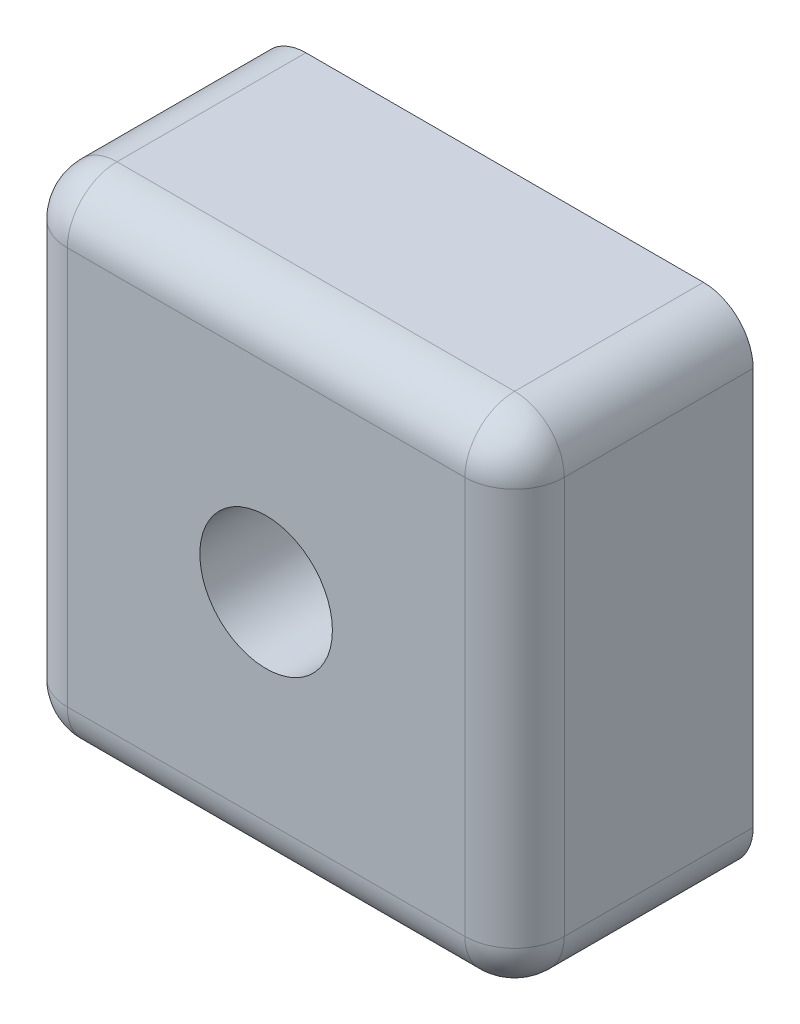
ISO-10303-21;
HEADER;
FILE_DESCRIPTION(('STEP AP214'),'2;1');
FILE_NAME('part.step','',(''),(''),'','','');
FILE_SCHEMA(('AUTOMOTIVE_DESIGN { 1 0 10303 214 1 1 1 1 }'));
ENDSEC;
DATA;
#1=APPLICATION_CONTEXT('core data for automotive mechanical design processes');
#2=APPLICATION_PROTOCOL_DEFINITION('international standard','automotive_design',2000,#1);
#3=PRODUCT_CONTEXT('',#1,'mechanical');
#4=PRODUCT('Part','Part','',(#3));
#5=PRODUCT_RELATED_PRODUCT_CATEGORY('part','',(#4));
#6=PRODUCT_DEFINITION_FORMATION('','',#4);
#7=PRODUCT_DEFINITION_CONTEXT('part definition',#1,'design');
#8=PRODUCT_DEFINITION('design','',#6,#7);
#9=PRODUCT_DEFINITION_SHAPE('','',#8);
#10=(LENGTH_UNIT() NAMED_UNIT(*) SI_UNIT(.MILLI.,.METRE.));
#11=(NAMED_UNIT(*) PLANE_ANGLE_UNIT() SI_UNIT($,.RADIAN.));
#12=(NAMED_UNIT(*) SI_UNIT($,.STERADIAN.) SOLID_ANGLE_UNIT());
#13=UNCERTAINTY_MEASURE_WITH_UNIT(LENGTH_MEASURE(1.E-05),#10,'distance_accuracy_value','');
#14=(GEOMETRIC_REPRESENTATION_CONTEXT(3) GLOBAL_UNCERTAINTY_ASSIGNED_CONTEXT((#13)) GLOBAL_UNIT_ASSIGNED_CONTEXT((#10,
#11,#12)) REPRESENTATION_CONTEXT('',''));
#15=CARTESIAN_POINT('',(0.,0.,0.));
#16=DIRECTION('',(0.,0.,1.));
#17=DIRECTION('',(1.,0.,0.));
#18=AXIS2_PLACEMENT_3D('',#15,#16,#17);
#19=CARTESIAN_POINT('',(50.,0.,48.));
#20=DIRECTION('',(-1.,0.,0.));
#21=DIRECTION('',(0.,0.,1.));
#22=AXIS2_PLACEMENT_3D('',#19,#20,#21);
#23=PLANE('',#22);
#24=DIRECTION('',(0.,0.,-1.));
#25=VECTOR('',#24,1.);
#26=CARTESIAN_POINT('',(50.,40.,48.));
#27=LINE('',#26,#25);
#28=CARTESIAN_POINT('',(50.,40.,0.));
#29=VERTEX_POINT('',#28);
#30=CARTESIAN_POINT('',(50.,40.,38.));
#31=VERTEX_POINT('',#30);
#32=EDGE_CURVE('E160',#29,#31,#27,.F.);
#33=ORIENTED_EDGE('',*,*,#32,.T.);
#34=DIRECTION('',(0.,1.,0.));
#35=VECTOR('',#34,1.);
#36=CARTESIAN_POINT('',(50.,-40.,38.));
#37=LINE('',#36,#35);
#38=CARTESIAN_POINT('',(50.,-40.,38.));
#39=VERTEX_POINT('',#38);
#40=EDGE_CURVE('E187',#31,#39,#37,.F.);
#41=ORIENTED_EDGE('',*,*,#40,.T.);
#42=DIRECTION('',(0.,0.,-1.));
#43=VECTOR('',#42,1.);
#44=CARTESIAN_POINT('',(50.,-40.,48.));
#45=LINE('',#44,#43);
#46=CARTESIAN_POINT('',(50.,-40.,0.));
#47=VERTEX_POINT('',#46);
#48=EDGE_CURVE('E162',#39,#47,#45,.T.);
#49=ORIENTED_EDGE('',*,*,#48,.T.);
#50=DIRECTION('',(0.,1.,0.));
#51=VECTOR('',#50,1.);
#52=CARTESIAN_POINT('',(50.,0.,0.));
#53=LINE('',#52,#51);
#54=EDGE_CURVE('E217',#47,#29,#53,.T.);
#55=ORIENTED_EDGE('',*,*,#54,.T.);
#56=EDGE_LOOP('',(#33,#41,#49,#55));
#57=FACE_BOUND('',#56,.T.);
#58=ADVANCED_FACE('F38',(#57),#23,.F.);
#59=CARTESIAN_POINT('',(0.,50.,48.));
#60=DIRECTION('',(0.,1.,0.));
#61=DIRECTION('',(0.,0.,1.));
#62=AXIS2_PLACEMENT_3D('',#59,#60,#61);
#63=PLANE('',#62);
#64=DIRECTION('',(0.,0.,-1.));
#65=VECTOR('',#64,1.);
#66=CARTESIAN_POINT('',(-40.,50.,48.));
#67=LINE('',#66,#65);
#68=CARTESIAN_POINT('',(-40.,50.,0.));
#69=VERTEX_POINT('',#68);
#70=CARTESIAN_POINT('',(-40.,50.,38.));
#71=VERTEX_POINT('',#70);
#72=EDGE_CURVE('E164',#69,#71,#67,.F.);
#73=ORIENTED_EDGE('',*,*,#72,.T.);
#74=DIRECTION('',(1.,0.,0.));
#75=VECTOR('',#74,1.);
#76=CARTESIAN_POINT('',(0.,50.,38.));
#77=LINE('',#76,#75);
#78=CARTESIAN_POINT('',(40.,50.,38.));
#79=VERTEX_POINT('',#78);
#80=EDGE_CURVE('E11',#71,#79,#77,.T.);
#81=ORIENTED_EDGE('',*,*,#80,.T.);
#82=DIRECTION('',(0.,0.,-1.));
#83=VECTOR('',#82,1.);
#84=CARTESIAN_POINT('',(40.,50.,0.));
#85=LINE('',#84,#83);
#86=CARTESIAN_POINT('',(40.,50.,0.));
#87=VERTEX_POINT('',#86);
#88=EDGE_CURVE('E166',#79,#87,#85,.T.);
#89=ORIENTED_EDGE('',*,*,#88,.T.);
#90=DIRECTION('',(1.,0.,0.));
#91=VECTOR('',#90,1.);
#92=CARTESIAN_POINT('',(0.,50.,0.));
#93=LINE('',#92,#91);
#94=EDGE_CURVE('E149',#69,#87,#93,.T.);
#95=ORIENTED_EDGE('',*,*,#94,.F.);
#96=EDGE_LOOP('',(#73,#81,#89,#95));
#97=FACE_BOUND('',#96,.T.);
#98=ADVANCED_FACE('F228',(#97),#63,.T.);
#99=CARTESIAN_POINT('',(-50.,0.,48.));
#100=DIRECTION('',(-1.,0.,0.));
#101=DIRECTION('',(0.,0.,1.));
#102=AXIS2_PLACEMENT_3D('',#99,#100,#101);
#103=PLANE('',#102);
#104=DIRECTION('',(0.,0.,-1.));
#105=VECTOR('',#104,1.);
#106=CARTESIAN_POINT('',(-50.,-40.,48.));
#107=LINE('',#106,#105);
#108=CARTESIAN_POINT('',(-50.,-40.,0.));
#109=VERTEX_POINT('',#108);
#110=CARTESIAN_POINT('',(-50.,-40.,38.));
#111=VERTEX_POINT('',#110);
#112=EDGE_CURVE('E134',#109,#111,#107,.F.);
#113=ORIENTED_EDGE('',*,*,#112,.T.);
#114=DIRECTION('',(0.,1.,0.));
#115=VECTOR('',#114,1.);
#116=CARTESIAN_POINT('',(-50.,0.,38.));
#117=LINE('',#116,#115);
#118=CARTESIAN_POINT('',(-50.,40.,38.));
#119=VERTEX_POINT('',#118);
#120=EDGE_CURVE('E171',#111,#119,#117,.T.);
#121=ORIENTED_EDGE('',*,*,#120,.T.);
#122=DIRECTION('',(0.,0.,-1.));
#123=VECTOR('',#122,1.);
#124=CARTESIAN_POINT('',(-50.,40.,48.));
#125=LINE('',#124,#123);
#126=CARTESIAN_POINT('',(-50.,40.,0.));
#127=VERTEX_POINT('',#126);
#128=EDGE_CURVE('E138',#119,#127,#125,.T.);
#129=ORIENTED_EDGE('',*,*,#128,.T.);
#130=DIRECTION('',(0.,1.,0.));
#131=VECTOR('',#130,1.);
#132=CARTESIAN_POINT('',(-50.,0.,0.));
#133=LINE('',#132,#131);
#134=EDGE_CURVE('E145',#109,#127,#133,.T.);
#135=ORIENTED_EDGE('',*,*,#134,.F.);
#136=EDGE_LOOP('',(#113,#121,#129,#135));
#137=FACE_BOUND('',#136,.T.);
#138=ADVANCED_FACE('F262',(#137),#103,.T.);
#139=CARTESIAN_POINT('',(0.,0.,48.));
#140=DIRECTION('',(0.,0.,-1.));
#141=DIRECTION('',(-1.,0.,0.));
#142=AXIS2_PLACEMENT_3D('',#139,#140,#141);
#143=CYLINDRICAL_SURFACE('',#142,13.33983914613);
#144=CARTESIAN_POINT('',(0.,0.,48.));
#145=DIRECTION('',(0.,0.,1.));
#146=DIRECTION('',(1.,0.,0.));
#147=AXIS2_PLACEMENT_3D('',#144,#145,#146);
#148=CIRCLE('',#147,13.33983914613);
#149=CARTESIAN_POINT('',(13.33983914613,0.,48.));
#150=VERTEX_POINT('',#149);
#151=EDGE_CURVE('E144',#150,#150,#148,.T.);
#152=ORIENTED_EDGE('',*,*,#151,.T.);
#153=EDGE_LOOP('',(#152));
#154=FACE_BOUND('',#153,.T.);
#155=CARTESIAN_POINT('',(0.,0.,0.));
#156=DIRECTION('',(0.,0.,1.));
#157=DIRECTION('',(1.,0.,0.));
#158=AXIS2_PLACEMENT_3D('',#155,#156,#157);
#159=CIRCLE('',#158,13.33983914613);
#160=CARTESIAN_POINT('',(13.33983914613,0.,0.));
#161=VERTEX_POINT('',#160);
#162=EDGE_CURVE('E212',#161,#161,#159,.T.);
#163=ORIENTED_EDGE('',*,*,#162,.F.);
#164=EDGE_LOOP('',(#163));
#165=FACE_BOUND('',#164,.T.);
#166=ADVANCED_FACE('F264',(#154,#165),#143,.F.);
#167=CARTESIAN_POINT('',(0.,-50.,48.));
#168=DIRECTION('',(0.,1.,0.));
#169=DIRECTION('',(0.,0.,1.));
#170=AXIS2_PLACEMENT_3D('',#167,#168,#169);
#171=PLANE('',#170);
#172=DIRECTION('',(0.,0.,-1.));
#173=VECTOR('',#172,1.);
#174=CARTESIAN_POINT('',(40.,-50.,48.));
#175=LINE('',#174,#173);
#176=CARTESIAN_POINT('',(40.,-50.,0.));
#177=VERTEX_POINT('',#176);
#178=CARTESIAN_POINT('',(40.,-50.,38.));
#179=VERTEX_POINT('',#178);
#180=EDGE_CURVE('E128',#177,#179,#175,.F.);
#181=ORIENTED_EDGE('',*,*,#180,.T.);
#182=DIRECTION('',(1.,0.,0.));
#183=VECTOR('',#182,1.);
#184=CARTESIAN_POINT('',(-40.,-50.,38.));
#185=LINE('',#184,#183);
#186=CARTESIAN_POINT('',(-40.,-50.,38.));
#187=VERTEX_POINT('',#186);
#188=EDGE_CURVE('E124',#179,#187,#185,.F.);
#189=ORIENTED_EDGE('',*,*,#188,.T.);
#190=DIRECTION('',(0.,0.,-1.));
#191=VECTOR('',#190,1.);
#192=CARTESIAN_POINT('',(-40.,-50.,0.));
#193=LINE('',#192,#191);
#194=CARTESIAN_POINT('',(-40.,-50.,0.));
#195=VERTEX_POINT('',#194);
#196=EDGE_CURVE('E116',#187,#195,#193,.T.);
#197=ORIENTED_EDGE('',*,*,#196,.T.);
#198=DIRECTION('',(1.,0.,0.));
#199=VECTOR('',#198,1.);
#200=CARTESIAN_POINT('',(0.,-50.,0.));
#201=LINE('',#200,#199);
#202=EDGE_CURVE('E121',#195,#177,#201,.T.);
#203=ORIENTED_EDGE('',*,*,#202,.T.);
#204=EDGE_LOOP('',(#181,#189,#197,#203));
#205=FACE_BOUND('',#204,.T.);
#206=ADVANCED_FACE('F119',(#205),#171,.F.);
#207=CARTESIAN_POINT('',(0.,0.,48.));
#208=DIRECTION('',(0.,0.,1.));
#209=DIRECTION('',(1.,0.,0.));
#210=AXIS2_PLACEMENT_3D('',#207,#208,#209);
#211=PLANE('',#210);
#212=DIRECTION('',(1.,0.,0.));
#213=VECTOR('',#212,1.);
#214=CARTESIAN_POINT('',(0.,40.,48.));
#215=LINE('',#214,#213);
#216=CARTESIAN_POINT('',(40.,40.,48.));
#217=VERTEX_POINT('',#216);
#218=CARTESIAN_POINT('',(-40.,40.,48.));
#219=VERTEX_POINT('',#218);
#220=EDGE_CURVE('E173',#217,#219,#215,.F.);
#221=ORIENTED_EDGE('',*,*,#220,.T.);
#222=DIRECTION('',(0.,1.,0.));
#223=VECTOR('',#222,1.);
#224=CARTESIAN_POINT('',(-40.,0.,48.));
#225=LINE('',#224,#223);
#226=CARTESIAN_POINT('',(-40.,-40.,48.));
#227=VERTEX_POINT('',#226);
#228=EDGE_CURVE('E179',#219,#227,#225,.F.);
#229=ORIENTED_EDGE('',*,*,#228,.T.);
#230=DIRECTION('',(1.,0.,0.));
#231=VECTOR('',#230,1.);
#232=CARTESIAN_POINT('',(40.,-40.,48.));
#233=LINE('',#232,#231);
#234=CARTESIAN_POINT('',(40.,-40.,48.));
#235=VERTEX_POINT('',#234);
#236=EDGE_CURVE('E177',#227,#235,#233,.T.);
#237=ORIENTED_EDGE('',*,*,#236,.T.);
#238=DIRECTION('',(0.,1.,0.));
#239=VECTOR('',#238,1.);
#240=CARTESIAN_POINT('',(40.,40.,48.));
#241=LINE('',#240,#239);
#242=EDGE_CURVE('E175',#235,#217,#241,.T.);
#243=ORIENTED_EDGE('',*,*,#242,.T.);
#244=EDGE_LOOP('',(#221,#229,#237,#243));
#245=FACE_BOUND('',#244,.T.);
#246=ORIENTED_EDGE('',*,*,#151,.F.);
#247=EDGE_LOOP('',(#246));
#248=FACE_BOUND('',#247,.T.);
#249=ADVANCED_FACE('F328',(#245,#248),#211,.T.);
#250=CARTESIAN_POINT('',(0.,0.,0.));
#251=DIRECTION('',(0.,0.,1.));
#252=DIRECTION('',(1.,0.,0.));
#253=AXIS2_PLACEMENT_3D('',#250,#251,#252);
#254=PLANE('',#253);
#255=ORIENTED_EDGE('',*,*,#162,.T.);
#256=EDGE_LOOP('',(#255));
#257=FACE_BOUND('',#256,.T.);
#258=ORIENTED_EDGE('',*,*,#202,.F.);
#259=CARTESIAN_POINT('',(-40.,-40.,0.));
#260=DIRECTION('',(0.,0.,1.));
#261=DIRECTION('',(1.,0.,0.));
#262=AXIS2_PLACEMENT_3D('',#259,#260,#261);
#263=CIRCLE('',#262,10.);
#264=EDGE_CURVE('E131',#195,#109,#263,.F.);
#265=ORIENTED_EDGE('',*,*,#264,.T.);
#266=ORIENTED_EDGE('',*,*,#134,.T.);
#267=CARTESIAN_POINT('',(-40.,40.,0.));
#268=DIRECTION('',(0.,0.,1.));
#269=DIRECTION('',(1.,0.,0.));
#270=AXIS2_PLACEMENT_3D('',#267,#268,#269);
#271=CIRCLE('',#270,10.);
#272=EDGE_CURVE('E127',#127,#69,#271,.F.);
#273=ORIENTED_EDGE('',*,*,#272,.T.);
#274=ORIENTED_EDGE('',*,*,#94,.T.);
#275=CARTESIAN_POINT('',(40.,40.,0.));
#276=DIRECTION('',(0.,0.,1.));
#277=DIRECTION('',(1.,0.,0.));
#278=AXIS2_PLACEMENT_3D('',#275,#276,#277);
#279=CIRCLE('',#278,10.);
#280=EDGE_CURVE('E155',#87,#29,#279,.F.);
#281=ORIENTED_EDGE('',*,*,#280,.T.);
#282=ORIENTED_EDGE('',*,*,#54,.F.);
#283=CARTESIAN_POINT('',(40.,-40.,0.));
#284=DIRECTION('',(0.,0.,1.));
#285=DIRECTION('',(1.,0.,0.));
#286=AXIS2_PLACEMENT_3D('',#283,#284,#285);
#287=CIRCLE('',#286,10.);
#288=EDGE_CURVE('E139',#47,#177,#287,.F.);
#289=ORIENTED_EDGE('',*,*,#288,.T.);
#290=EDGE_LOOP('',(#258,#265,#266,#273,#274,#281,#282,#289));
#291=FACE_BOUND('',#290,.T.);
#292=ADVANCED_FACE('F141',(#257,#291),#254,.F.);
#293=CARTESIAN_POINT('',(-40.,-40.,48.));
#294=DIRECTION('',(0.,0.,1.));
#295=DIRECTION('',(1.,0.,0.));
#296=AXIS2_PLACEMENT_3D('',#293,#294,#295);
#297=CYLINDRICAL_SURFACE('',#296,10.);
#298=ORIENTED_EDGE('',*,*,#196,.F.);
#299=CARTESIAN_POINT('',(-40.,-40.,38.));
#300=DIRECTION('',(0.,0.,1.));
#301=DIRECTION('',(1.,0.,0.));
#302=AXIS2_PLACEMENT_3D('',#299,#300,#301);
#303=CIRCLE('',#302,10.);
#304=EDGE_CURVE('E182',#187,#111,#303,.F.);
#305=ORIENTED_EDGE('',*,*,#304,.T.);
#306=ORIENTED_EDGE('',*,*,#112,.F.);
#307=ORIENTED_EDGE('',*,*,#264,.F.);
#308=EDGE_LOOP('',(#298,#305,#306,#307));
#309=FACE_BOUND('',#308,.T.);
#310=ADVANCED_FACE('F132',(#309),#297,.T.);
#311=CARTESIAN_POINT('',(40.,-40.,48.));
#312=DIRECTION('',(0.,0.,-1.));
#313=DIRECTION('',(-1.,0.,0.));
#314=AXIS2_PLACEMENT_3D('',#311,#312,#313);
#315=CYLINDRICAL_SURFACE('',#314,10.);
#316=ORIENTED_EDGE('',*,*,#48,.F.);
#317=CARTESIAN_POINT('',(40.,-40.,38.));
#318=DIRECTION('',(0.,0.,-1.));
#319=DIRECTION('',(-1.,0.,0.));
#320=AXIS2_PLACEMENT_3D('',#317,#318,#319);
#321=CIRCLE('',#320,10.);
#322=EDGE_CURVE('E185',#39,#179,#321,.T.);
#323=ORIENTED_EDGE('',*,*,#322,.T.);
#324=ORIENTED_EDGE('',*,*,#180,.F.);
#325=ORIENTED_EDGE('',*,*,#288,.F.);
#326=EDGE_LOOP('',(#316,#323,#324,#325));
#327=FACE_BOUND('',#326,.T.);
#328=ADVANCED_FACE('F255',(#327),#315,.T.);
#329=CARTESIAN_POINT('',(40.,40.,48.));
#330=DIRECTION('',(0.,0.,1.));
#331=DIRECTION('',(1.,0.,0.));
#332=AXIS2_PLACEMENT_3D('',#329,#330,#331);
#333=CYLINDRICAL_SURFACE('',#332,10.);
#334=ORIENTED_EDGE('',*,*,#88,.F.);
#335=CARTESIAN_POINT('',(40.,40.,38.));
#336=DIRECTION('',(0.,0.,1.));
#337=DIRECTION('',(1.,0.,0.));
#338=AXIS2_PLACEMENT_3D('',#335,#336,#337);
#339=CIRCLE('',#338,10.);
#340=EDGE_CURVE('E47',#79,#31,#339,.F.);
#341=ORIENTED_EDGE('',*,*,#340,.T.);
#342=ORIENTED_EDGE('',*,*,#32,.F.);
#343=ORIENTED_EDGE('',*,*,#280,.F.);
#344=EDGE_LOOP('',(#334,#341,#342,#343));
#345=FACE_BOUND('',#344,.T.);
#346=ADVANCED_FACE('F283',(#345),#333,.T.);
#347=CARTESIAN_POINT('',(-40.,40.,48.));
#348=DIRECTION('',(0.,0.,-1.));
#349=DIRECTION('',(-1.,0.,0.));
#350=AXIS2_PLACEMENT_3D('',#347,#348,#349);
#351=CYLINDRICAL_SURFACE('',#350,10.);
#352=ORIENTED_EDGE('',*,*,#128,.F.);
#353=CARTESIAN_POINT('',(-40.,40.,38.));
#354=DIRECTION('',(0.,0.,-1.));
#355=DIRECTION('',(-1.,0.,0.));
#356=AXIS2_PLACEMENT_3D('',#353,#354,#355);
#357=CIRCLE('',#356,10.);
#358=EDGE_CURVE('E168',#119,#71,#357,.T.);
#359=ORIENTED_EDGE('',*,*,#358,.T.);
#360=ORIENTED_EDGE('',*,*,#72,.F.);
#361=ORIENTED_EDGE('',*,*,#272,.F.);
#362=EDGE_LOOP('',(#352,#359,#360,#361));
#363=FACE_BOUND('',#362,.T.);
#364=ADVANCED_FACE('F231',(#363),#351,.T.);
#365=CARTESIAN_POINT('',(40.,-40.,38.));
#366=DIRECTION('',(0.,0.,1.));
#367=DIRECTION('',(1.,0.,0.));
#368=AXIS2_PLACEMENT_3D('',#365,#366,#367);
#369=SPHERICAL_SURFACE('',#368,10.);
#370=CARTESIAN_POINT('',(40.,-40.,38.));
#371=DIRECTION('',(-1.,0.,0.));
#372=DIRECTION('',(0.,0.,1.));
#373=AXIS2_PLACEMENT_3D('',#370,#371,#372);
#374=CIRCLE('',#373,10.);
#375=EDGE_CURVE('E205',#179,#235,#374,.T.);
#376=ORIENTED_EDGE('',*,*,#375,.F.);
#377=ORIENTED_EDGE('',*,*,#322,.F.);
#378=CARTESIAN_POINT('',(40.,-40.,38.));
#379=DIRECTION('',(0.,1.,0.));
#380=DIRECTION('',(0.,0.,1.));
#381=AXIS2_PLACEMENT_3D('',#378,#379,#380);
#382=CIRCLE('',#381,10.);
#383=EDGE_CURVE('E42',#235,#39,#382,.T.);
#384=ORIENTED_EDGE('',*,*,#383,.F.);
#385=EDGE_LOOP('',(#376,#377,#384));
#386=FACE_BOUND('',#385,.T.);
#387=ADVANCED_FACE('F40',(#386),#369,.T.);
#388=CARTESIAN_POINT('',(40.,0.,38.));
#389=DIRECTION('',(0.,-1.,0.));
#390=DIRECTION('',(0.,0.,-1.));
#391=AXIS2_PLACEMENT_3D('',#388,#389,#390);
#392=CYLINDRICAL_SURFACE('',#391,10.);
#393=ORIENTED_EDGE('',*,*,#383,.T.);
#394=ORIENTED_EDGE('',*,*,#40,.F.);
#395=CARTESIAN_POINT('',(40.,40.,38.));
#396=DIRECTION('',(0.,1.,0.));
#397=DIRECTION('',(0.,0.,1.));
#398=AXIS2_PLACEMENT_3D('',#395,#396,#397);
#399=CIRCLE('',#398,10.);
#400=EDGE_CURVE('E203',#217,#31,#399,.T.);
#401=ORIENTED_EDGE('',*,*,#400,.F.);
#402=ORIENTED_EDGE('',*,*,#242,.F.);
#403=EDGE_LOOP('',(#393,#394,#401,#402));
#404=FACE_BOUND('',#403,.T.);
#405=ADVANCED_FACE('F250',(#404),#392,.T.);
#406=CARTESIAN_POINT('',(0.,-40.,38.));
#407=DIRECTION('',(-1.,0.,0.));
#408=DIRECTION('',(0.,0.,1.));
#409=AXIS2_PLACEMENT_3D('',#406,#407,#408);
#410=CYLINDRICAL_SURFACE('',#409,10.);
#411=ORIENTED_EDGE('',*,*,#375,.T.);
#412=ORIENTED_EDGE('',*,*,#236,.F.);
#413=CARTESIAN_POINT('',(-40.,-40.,38.));
#414=DIRECTION('',(-1.,0.,0.));
#415=DIRECTION('',(0.,0.,1.));
#416=AXIS2_PLACEMENT_3D('',#413,#414,#415);
#417=CIRCLE('',#416,10.);
#418=EDGE_CURVE('E200',#187,#227,#417,.T.);
#419=ORIENTED_EDGE('',*,*,#418,.F.);
#420=ORIENTED_EDGE('',*,*,#188,.F.);
#421=EDGE_LOOP('',(#411,#412,#419,#420));
#422=FACE_BOUND('',#421,.T.);
#423=ADVANCED_FACE('F257',(#422),#410,.T.);
#424=CARTESIAN_POINT('',(40.,40.,38.));
#425=DIRECTION('',(0.,0.,1.));
#426=DIRECTION('',(1.,0.,0.));
#427=AXIS2_PLACEMENT_3D('',#424,#425,#426);
#428=SPHERICAL_SURFACE('',#427,10.);
#429=ORIENTED_EDGE('',*,*,#400,.T.);
#430=ORIENTED_EDGE('',*,*,#340,.F.);
#431=CARTESIAN_POINT('',(40.,40.,38.));
#432=DIRECTION('',(-1.,0.,0.));
#433=DIRECTION('',(0.,0.,1.));
#434=AXIS2_PLACEMENT_3D('',#431,#432,#433);
#435=CIRCLE('',#434,10.);
#436=EDGE_CURVE('E197',#217,#79,#435,.T.);
#437=ORIENTED_EDGE('',*,*,#436,.F.);
#438=EDGE_LOOP('',(#429,#430,#437));
#439=FACE_BOUND('',#438,.T.);
#440=ADVANCED_FACE('F248',(#439),#428,.T.);
#441=CARTESIAN_POINT('',(-40.,-40.,38.));
#442=DIRECTION('',(0.,0.,1.));
#443=DIRECTION('',(1.,0.,0.));
#444=AXIS2_PLACEMENT_3D('',#441,#442,#443);
#445=SPHERICAL_SURFACE('',#444,10.);
#446=ORIENTED_EDGE('',*,*,#304,.F.);
#447=ORIENTED_EDGE('',*,*,#418,.T.);
#448=CARTESIAN_POINT('',(-40.,-40.,38.));
#449=DIRECTION('',(0.,1.,0.));
#450=DIRECTION('',(0.,0.,1.));
#451=AXIS2_PLACEMENT_3D('',#448,#449,#450);
#452=CIRCLE('',#451,10.);
#453=EDGE_CURVE('E195',#111,#227,#452,.T.);
#454=ORIENTED_EDGE('',*,*,#453,.F.);
#455=EDGE_LOOP('',(#446,#447,#454));
#456=FACE_BOUND('',#455,.T.);
#457=ADVANCED_FACE('F260',(#456),#445,.T.);
#458=CARTESIAN_POINT('',(0.,40.,38.));
#459=DIRECTION('',(1.,0.,0.));
#460=DIRECTION('',(0.,0.,-1.));
#461=AXIS2_PLACEMENT_3D('',#458,#459,#460);
#462=CYLINDRICAL_SURFACE('',#461,10.);
#463=ORIENTED_EDGE('',*,*,#436,.T.);
#464=ORIENTED_EDGE('',*,*,#80,.F.);
#465=CARTESIAN_POINT('',(-40.,40.,38.));
#466=DIRECTION('',(-1.,0.,0.));
#467=DIRECTION('',(0.,0.,1.));
#468=AXIS2_PLACEMENT_3D('',#465,#466,#467);
#469=CIRCLE('',#468,10.);
#470=EDGE_CURVE('E193',#219,#71,#469,.T.);
#471=ORIENTED_EDGE('',*,*,#470,.F.);
#472=ORIENTED_EDGE('',*,*,#220,.F.);
#473=EDGE_LOOP('',(#463,#464,#471,#472));
#474=FACE_BOUND('',#473,.T.);
#475=ADVANCED_FACE('F245',(#474),#462,.T.);
#476=CARTESIAN_POINT('',(-40.,0.,38.));
#477=DIRECTION('',(0.,1.,0.));
#478=DIRECTION('',(0.,0.,1.));
#479=AXIS2_PLACEMENT_3D('',#476,#477,#478);
#480=CYLINDRICAL_SURFACE('',#479,10.);
#481=ORIENTED_EDGE('',*,*,#453,.T.);
#482=ORIENTED_EDGE('',*,*,#228,.F.);
#483=CARTESIAN_POINT('',(-40.,40.,38.));
#484=DIRECTION('',(0.,1.,0.));
#485=DIRECTION('',(0.,0.,1.));
#486=AXIS2_PLACEMENT_3D('',#483,#484,#485);
#487=CIRCLE('',#486,10.);
#488=EDGE_CURVE('E190',#119,#219,#487,.T.);
#489=ORIENTED_EDGE('',*,*,#488,.F.);
#490=ORIENTED_EDGE('',*,*,#120,.F.);
#491=EDGE_LOOP('',(#481,#482,#489,#490));
#492=FACE_BOUND('',#491,.T.);
#493=ADVANCED_FACE('F240',(#492),#480,.T.);
#494=CARTESIAN_POINT('',(-40.,40.,38.));
#495=DIRECTION('',(0.,0.,1.));
#496=DIRECTION('',(1.,0.,0.));
#497=AXIS2_PLACEMENT_3D('',#494,#495,#496);
#498=SPHERICAL_SURFACE('',#497,10.);
#499=ORIENTED_EDGE('',*,*,#470,.T.);
#500=ORIENTED_EDGE('',*,*,#358,.F.);
#501=ORIENTED_EDGE('',*,*,#488,.T.);
#502=EDGE_LOOP('',(#499,#500,#501));
#503=FACE_BOUND('',#502,.T.);
#504=ADVANCED_FACE('F235',(#503),#498,.T.);
#505=CLOSED_SHELL('',(#58,#98,#138,#166,#206,#249,#292,#310,#328,#346,#364,#387,#405,#423,#440,
#457,#475,#493,#504));
#506=MANIFOLD_SOLID_BREP('B2',#505);
#507=ADVANCED_BREP_SHAPE_REPRESENTATION('',(#18,#506),#14);
#508=SHAPE_DEFINITION_REPRESENTATION(#9,#507);
ENDSEC;
END-ISO-10303-21;
